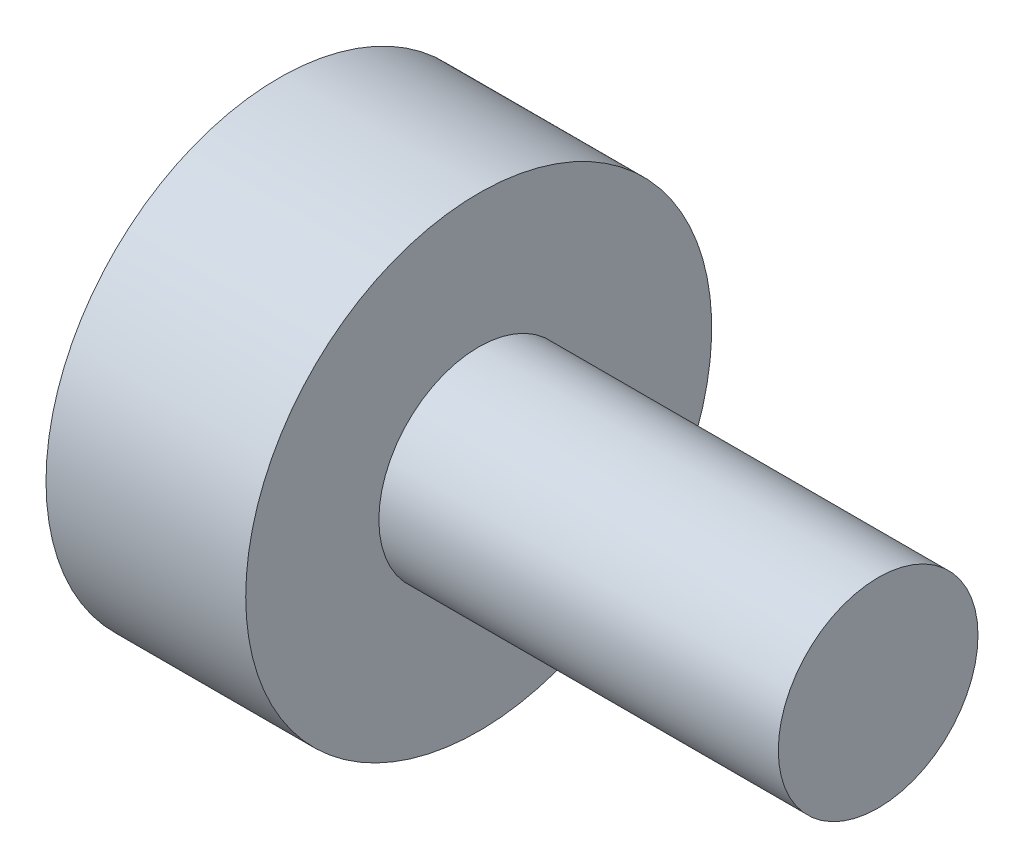
ISO-10303-21;
HEADER;
FILE_DESCRIPTION(('STEP AP214'),'2;1');
FILE_NAME('part.step','',(''),(''),'','','');
FILE_SCHEMA(('AUTOMOTIVE_DESIGN { 1 0 10303 214 1 1 1 1 }'));
ENDSEC;
DATA;
#1=APPLICATION_CONTEXT('core data for automotive mechanical design processes');
#2=APPLICATION_PROTOCOL_DEFINITION('international standard','automotive_design',2000,#1);
#3=PRODUCT_CONTEXT('',#1,'mechanical');
#4=PRODUCT('Part','Part','',(#3));
#5=PRODUCT_RELATED_PRODUCT_CATEGORY('part','',(#4));
#6=PRODUCT_DEFINITION_FORMATION('','',#4);
#7=PRODUCT_DEFINITION_CONTEXT('part definition',#1,'design');
#8=PRODUCT_DEFINITION('design','',#6,#7);
#9=PRODUCT_DEFINITION_SHAPE('','',#8);
#10=(LENGTH_UNIT() NAMED_UNIT(*) SI_UNIT(.MILLI.,.METRE.));
#11=(NAMED_UNIT(*) PLANE_ANGLE_UNIT() SI_UNIT($,.RADIAN.));
#12=(NAMED_UNIT(*) SI_UNIT($,.STERADIAN.) SOLID_ANGLE_UNIT());
#13=UNCERTAINTY_MEASURE_WITH_UNIT(LENGTH_MEASURE(1.E-05),#10,'distance_accuracy_value','');
#14=(GEOMETRIC_REPRESENTATION_CONTEXT(3) GLOBAL_UNCERTAINTY_ASSIGNED_CONTEXT((#13)) GLOBAL_UNIT_ASSIGNED_CONTEXT((#10,
#11,#12)) REPRESENTATION_CONTEXT('',''));
#15=CARTESIAN_POINT('',(0.,0.,0.));
#16=DIRECTION('',(0.,0.,1.));
#17=DIRECTION('',(1.,0.,0.));
#18=AXIS2_PLACEMENT_3D('',#15,#16,#17);
#19=CARTESIAN_POINT('',(0.,0.,0.));
#20=DIRECTION('',(1.,0.,0.));
#21=DIRECTION('',(0.,0.,-1.));
#22=AXIS2_PLACEMENT_3D('',#19,#20,#21);
#23=PLANE('',#22);
#24=CARTESIAN_POINT('',(0.,10.,10.));
#25=DIRECTION('',(1.,0.,0.));
#26=DIRECTION('',(0.,0.,-1.));
#27=AXIS2_PLACEMENT_3D('',#24,#25,#26);
#28=CIRCLE('',#27,5.);
#29=CARTESIAN_POINT('',(0.,10.,5.));
#30=VERTEX_POINT('',#29);
#31=EDGE_CURVE('E69',#30,#30,#28,.T.);
#32=ORIENTED_EDGE('',*,*,#31,.T.);
#33=EDGE_LOOP('',(#32));
#34=FACE_BOUND('',#33,.T.);
#35=CARTESIAN_POINT('',(0.,10.,-10.));
#36=DIRECTION('',(1.,0.,0.));
#37=DIRECTION('',(0.,0.,-1.));
#38=AXIS2_PLACEMENT_3D('',#35,#36,#37);
#39=CIRCLE('',#38,5.);
#40=CARTESIAN_POINT('',(0.,10.,-15.));
#41=VERTEX_POINT('',#40);
#42=EDGE_CURVE('E63',#41,#41,#39,.T.);
#43=ORIENTED_EDGE('',*,*,#42,.T.);
#44=EDGE_LOOP('',(#43));
#45=FACE_BOUND('',#44,.T.);
#46=CARTESIAN_POINT('',(0.,0.,0.));
#47=DIRECTION('',(-1.,0.,0.));
#48=DIRECTION('',(0.,0.,1.));
#49=AXIS2_PLACEMENT_3D('',#46,#47,#48);
#50=CIRCLE('',#49,20.);
#51=CARTESIAN_POINT('',(0.,0.,20.));
#52=VERTEX_POINT('',#51);
#53=EDGE_CURVE('E10',#52,#52,#50,.T.);
#54=ORIENTED_EDGE('',*,*,#53,.T.);
#55=EDGE_LOOP('',(#54));
#56=FACE_BOUND('',#55,.T.);
#57=ADVANCED_FACE('F37',(#34,#45,#56),#23,.F.);
#58=CARTESIAN_POINT('',(0.,0.,0.));
#59=DIRECTION('',(-1.,0.,0.));
#60=DIRECTION('',(0.,0.,1.));
#61=AXIS2_PLACEMENT_3D('',#58,#59,#60);
#62=CYLINDRICAL_SURFACE('',#61,20.);
#63=ORIENTED_EDGE('',*,*,#53,.F.);
#64=EDGE_LOOP('',(#63));
#65=FACE_BOUND('',#64,.T.);
#66=CARTESIAN_POINT('',(10.,0.,0.));
#67=DIRECTION('',(-1.,0.,0.));
#68=DIRECTION('',(0.,0.,1.));
#69=AXIS2_PLACEMENT_3D('',#66,#67,#68);
#70=CIRCLE('',#69,20.);
#71=CARTESIAN_POINT('',(10.,0.,20.));
#72=VERTEX_POINT('',#71);
#73=EDGE_CURVE('E43',#72,#72,#70,.T.);
#74=ORIENTED_EDGE('',*,*,#73,.T.);
#75=EDGE_LOOP('',(#74));
#76=FACE_BOUND('',#75,.T.);
#77=ADVANCED_FACE('F87',(#65,#76),#62,.T.);
#78=CARTESIAN_POINT('',(10.,20.,0.));
#79=DIRECTION('',(1.,0.,0.));
#80=DIRECTION('',(0.,0.,-1.));
#81=AXIS2_PLACEMENT_3D('',#78,#79,#80);
#82=PLANE('',#81);
#83=ORIENTED_EDGE('',*,*,#73,.F.);
#84=EDGE_LOOP('',(#83));
#85=FACE_BOUND('',#84,.T.);
#86=CARTESIAN_POINT('',(10.,0.,0.));
#87=DIRECTION('',(-1.,0.,0.));
#88=DIRECTION('',(0.,0.,1.));
#89=AXIS2_PLACEMENT_3D('',#86,#87,#88);
#90=CIRCLE('',#89,35.);
#91=CARTESIAN_POINT('',(10.,0.,35.));
#92=VERTEX_POINT('',#91);
#93=EDGE_CURVE('E47',#92,#92,#90,.T.);
#94=ORIENTED_EDGE('',*,*,#93,.T.);
#95=EDGE_LOOP('',(#94));
#96=FACE_BOUND('',#95,.T.);
#97=ADVANCED_FACE('F93',(#85,#96),#82,.F.);
#98=CARTESIAN_POINT('',(0.,0.,0.));
#99=DIRECTION('',(-1.,0.,0.));
#100=DIRECTION('',(0.,0.,1.));
#101=AXIS2_PLACEMENT_3D('',#98,#99,#100);
#102=CYLINDRICAL_SURFACE('',#101,35.);
#103=ORIENTED_EDGE('',*,*,#93,.F.);
#104=EDGE_LOOP('',(#103));
#105=FACE_BOUND('',#104,.T.);
#106=CARTESIAN_POINT('',(40.,0.,0.));
#107=DIRECTION('',(-1.,0.,0.));
#108=DIRECTION('',(0.,0.,1.));
#109=AXIS2_PLACEMENT_3D('',#106,#107,#108);
#110=CIRCLE('',#109,35.);
#111=CARTESIAN_POINT('',(40.,0.,35.));
#112=VERTEX_POINT('',#111);
#113=EDGE_CURVE('E51',#112,#112,#110,.T.);
#114=ORIENTED_EDGE('',*,*,#113,.T.);
#115=EDGE_LOOP('',(#114));
#116=FACE_BOUND('',#115,.T.);
#117=ADVANCED_FACE('F119',(#105,#116),#102,.T.);
#118=CARTESIAN_POINT('',(40.,35.,0.));
#119=DIRECTION('',(-1.,0.,0.));
#120=DIRECTION('',(0.,0.,1.));
#121=AXIS2_PLACEMENT_3D('',#118,#119,#120);
#122=PLANE('',#121);
#123=ORIENTED_EDGE('',*,*,#113,.F.);
#124=EDGE_LOOP('',(#123));
#125=FACE_BOUND('',#124,.T.);
#126=CARTESIAN_POINT('',(40.,0.,0.));
#127=DIRECTION('',(-1.,0.,0.));
#128=DIRECTION('',(0.,0.,1.));
#129=AXIS2_PLACEMENT_3D('',#126,#127,#128);
#130=CIRCLE('',#129,15.);
#131=CARTESIAN_POINT('',(40.,0.,15.));
#132=VERTEX_POINT('',#131);
#133=EDGE_CURVE('E56',#132,#132,#130,.T.);
#134=ORIENTED_EDGE('',*,*,#133,.T.);
#135=EDGE_LOOP('',(#134));
#136=FACE_BOUND('',#135,.T.);
#137=ADVANCED_FACE('F115',(#125,#136),#122,.F.);
#138=CARTESIAN_POINT('',(0.,0.,0.));
#139=DIRECTION('',(-1.,0.,0.));
#140=DIRECTION('',(0.,0.,1.));
#141=AXIS2_PLACEMENT_3D('',#138,#139,#140);
#142=CYLINDRICAL_SURFACE('',#141,15.);
#143=ORIENTED_EDGE('',*,*,#133,.F.);
#144=EDGE_LOOP('',(#143));
#145=FACE_BOUND('',#144,.T.);
#146=CARTESIAN_POINT('',(100.,0.,0.));
#147=DIRECTION('',(-1.,0.,0.));
#148=DIRECTION('',(0.,0.,1.));
#149=AXIS2_PLACEMENT_3D('',#146,#147,#148);
#150=CIRCLE('',#149,15.);
#151=CARTESIAN_POINT('',(100.,0.,15.));
#152=VERTEX_POINT('',#151);
#153=EDGE_CURVE('E59',#152,#152,#150,.T.);
#154=ORIENTED_EDGE('',*,*,#153,.T.);
#155=EDGE_LOOP('',(#154));
#156=FACE_BOUND('',#155,.T.);
#157=ADVANCED_FACE('F109',(#145,#156),#142,.T.);
#158=CARTESIAN_POINT('',(100.,0.,0.));
#159=DIRECTION('',(-1.,0.,0.));
#160=DIRECTION('',(0.,0.,1.));
#161=AXIS2_PLACEMENT_3D('',#158,#159,#160);
#162=PLANE('',#161);
#163=ORIENTED_EDGE('',*,*,#153,.F.);
#164=EDGE_LOOP('',(#163));
#165=FACE_BOUND('',#164,.T.);
#166=ADVANCED_FACE('F101',(#165),#162,.F.);
#167=CARTESIAN_POINT('',(20.,10.,-10.));
#168=DIRECTION('',(-1.,0.,0.));
#169=DIRECTION('',(0.,0.,1.));
#170=AXIS2_PLACEMENT_3D('',#167,#168,#169);
#171=CYLINDRICAL_SURFACE('',#170,5.);
#172=CARTESIAN_POINT('',(20.,10.,-10.));
#173=DIRECTION('',(1.,0.,0.));
#174=DIRECTION('',(0.,0.,-1.));
#175=AXIS2_PLACEMENT_3D('',#172,#173,#174);
#176=CIRCLE('',#175,5.);
#177=CARTESIAN_POINT('',(20.,10.,-15.));
#178=VERTEX_POINT('',#177);
#179=EDGE_CURVE('E62',#178,#178,#176,.T.);
#180=ORIENTED_EDGE('',*,*,#179,.T.);
#181=EDGE_LOOP('',(#180));
#182=FACE_BOUND('',#181,.T.);
#183=ORIENTED_EDGE('',*,*,#42,.F.);
#184=EDGE_LOOP('',(#183));
#185=FACE_BOUND('',#184,.T.);
#186=ADVANCED_FACE('F99',(#182,#185),#171,.F.);
#187=CARTESIAN_POINT('',(20.,10.,-10.));
#188=DIRECTION('',(1.,0.,0.));
#189=DIRECTION('',(0.,0.,-1.));
#190=AXIS2_PLACEMENT_3D('',#187,#188,#189);
#191=PLANE('',#190);
#192=ORIENTED_EDGE('',*,*,#179,.F.);
#193=EDGE_LOOP('',(#192));
#194=FACE_BOUND('',#193,.T.);
#195=ADVANCED_FACE('F84',(#194),#191,.F.);
#196=CARTESIAN_POINT('',(20.,10.,10.));
#197=DIRECTION('',(-1.,0.,0.));
#198=DIRECTION('',(0.,0.,1.));
#199=AXIS2_PLACEMENT_3D('',#196,#197,#198);
#200=CYLINDRICAL_SURFACE('',#199,5.);
#201=CARTESIAN_POINT('',(20.,10.,10.));
#202=DIRECTION('',(1.,0.,0.));
#203=DIRECTION('',(0.,0.,-1.));
#204=AXIS2_PLACEMENT_3D('',#201,#202,#203);
#205=CIRCLE('',#204,5.);
#206=CARTESIAN_POINT('',(20.,10.,5.));
#207=VERTEX_POINT('',#206);
#208=EDGE_CURVE('E66',#207,#207,#205,.T.);
#209=ORIENTED_EDGE('',*,*,#208,.T.);
#210=EDGE_LOOP('',(#209));
#211=FACE_BOUND('',#210,.T.);
#212=ORIENTED_EDGE('',*,*,#31,.F.);
#213=EDGE_LOOP('',(#212));
#214=FACE_BOUND('',#213,.T.);
#215=ADVANCED_FACE('F75',(#211,#214),#200,.F.);
#216=CARTESIAN_POINT('',(20.,10.,10.));
#217=DIRECTION('',(1.,0.,0.));
#218=DIRECTION('',(0.,0.,-1.));
#219=AXIS2_PLACEMENT_3D('',#216,#217,#218);
#220=PLANE('',#219);
#221=ORIENTED_EDGE('',*,*,#208,.F.);
#222=EDGE_LOOP('',(#221));
#223=FACE_BOUND('',#222,.T.);
#224=ADVANCED_FACE('F78',(#223),#220,.F.);
#225=CLOSED_SHELL('',(#57,#77,#97,#117,#137,#157,#166,#186,#195,#215,#224));
#226=MANIFOLD_SOLID_BREP('B2',#225);
#227=ADVANCED_BREP_SHAPE_REPRESENTATION('',(#18,#226),#14);
#228=SHAPE_DEFINITION_REPRESENTATION(#9,#227);
ENDSEC;
END-ISO-10303-21;
